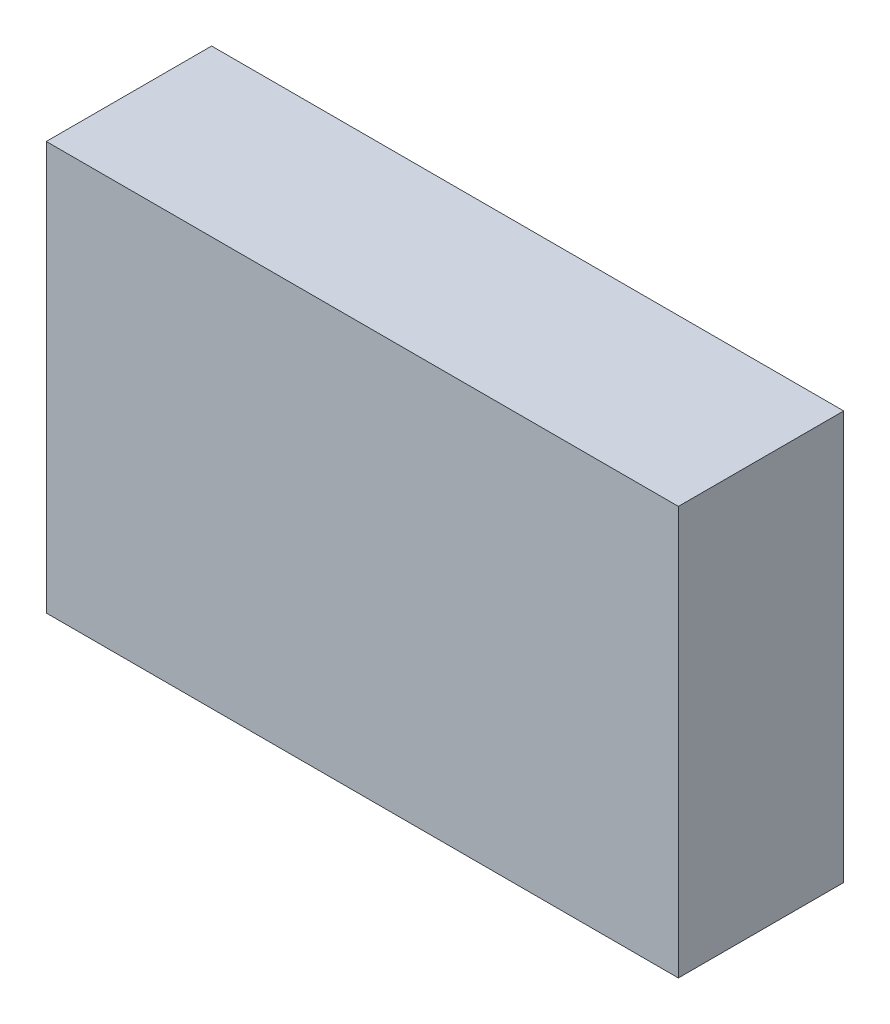
ISO-10303-21;
HEADER;
FILE_DESCRIPTION(('STEP AP214'),'2;1');
FILE_NAME('part.step','',(''),(''),'','','');
FILE_SCHEMA(('AUTOMOTIVE_DESIGN { 1 0 10303 214 1 1 1 1 }'));
ENDSEC;
DATA;
#1=APPLICATION_CONTEXT('core data for automotive mechanical design processes');
#2=APPLICATION_PROTOCOL_DEFINITION('international standard','automotive_design',2000,#1);
#3=PRODUCT_CONTEXT('',#1,'mechanical');
#4=PRODUCT('Part','Part','',(#3));
#5=PRODUCT_RELATED_PRODUCT_CATEGORY('part','',(#4));
#6=PRODUCT_DEFINITION_FORMATION('','',#4);
#7=PRODUCT_DEFINITION_CONTEXT('part definition',#1,'design');
#8=PRODUCT_DEFINITION('design','',#6,#7);
#9=PRODUCT_DEFINITION_SHAPE('','',#8);
#10=(LENGTH_UNIT() NAMED_UNIT(*) SI_UNIT(.MILLI.,.METRE.));
#11=(NAMED_UNIT(*) PLANE_ANGLE_UNIT() SI_UNIT($,.RADIAN.));
#12=(NAMED_UNIT(*) SI_UNIT($,.STERADIAN.) SOLID_ANGLE_UNIT());
#13=UNCERTAINTY_MEASURE_WITH_UNIT(LENGTH_MEASURE(1.E-05),#10,'distance_accuracy_value','');
#14=(GEOMETRIC_REPRESENTATION_CONTEXT(3) GLOBAL_UNCERTAINTY_ASSIGNED_CONTEXT((#13)) GLOBAL_UNIT_ASSIGNED_CONTEXT((#10,
#11,#12)) REPRESENTATION_CONTEXT('',''));
#15=CARTESIAN_POINT('',(0.,0.,0.));
#16=DIRECTION('',(0.,0.,1.));
#17=DIRECTION('',(1.,0.,0.));
#18=AXIS2_PLACEMENT_3D('',#15,#16,#17);
#19=CARTESIAN_POINT('',(0.,0.,8.5));
#20=DIRECTION('',(0.,0.,1.));
#21=DIRECTION('',(1.,0.,0.));
#22=AXIS2_PLACEMENT_3D('',#19,#20,#21);
#23=PLANE('',#22);
#24=DIRECTION('',(-1.,0.,0.));
#25=VECTOR('',#24,1.);
#26=CARTESIAN_POINT('',(0.,-21.,8.5));
#27=LINE('',#26,#25);
#28=CARTESIAN_POINT('',(32.5,-21.,8.5));
#29=VERTEX_POINT('',#28);
#30=CARTESIAN_POINT('',(-32.5,-21.,8.5));
#31=VERTEX_POINT('',#30);
#32=EDGE_CURVE('E10',#29,#31,#27,.T.);
#33=ORIENTED_EDGE('',*,*,#32,.F.);
#34=DIRECTION('',(0.,-1.,0.));
#35=VECTOR('',#34,1.);
#36=CARTESIAN_POINT('',(32.5,0.,8.5));
#37=LINE('',#36,#35);
#38=CARTESIAN_POINT('',(32.5,21.,8.5));
#39=VERTEX_POINT('',#38);
#40=EDGE_CURVE('E58',#39,#29,#37,.T.);
#41=ORIENTED_EDGE('',*,*,#40,.F.);
#42=DIRECTION('',(1.,0.,0.));
#43=VECTOR('',#42,1.);
#44=CARTESIAN_POINT('',(0.,21.,8.5));
#45=LINE('',#44,#43);
#46=CARTESIAN_POINT('',(-32.5,21.,8.5));
#47=VERTEX_POINT('',#46);
#48=EDGE_CURVE('E88',#47,#39,#45,.T.);
#49=ORIENTED_EDGE('',*,*,#48,.F.);
#50=DIRECTION('',(0.,1.,0.));
#51=VECTOR('',#50,1.);
#52=CARTESIAN_POINT('',(-32.5,0.,8.5));
#53=LINE('',#52,#51);
#54=EDGE_CURVE('E23',#31,#47,#53,.T.);
#55=ORIENTED_EDGE('',*,*,#54,.F.);
#56=EDGE_LOOP('',(#33,#41,#49,#55));
#57=FACE_BOUND('',#56,.T.);
#58=ADVANCED_FACE('F16',(#57),#23,.T.);
#59=CARTESIAN_POINT('',(0.,-21.,-8.5));
#60=DIRECTION('',(0.,-1.,0.));
#61=DIRECTION('',(0.,0.,-1.));
#62=AXIS2_PLACEMENT_3D('',#59,#60,#61);
#63=PLANE('',#62);
#64=DIRECTION('',(0.,0.,1.));
#65=VECTOR('',#64,1.);
#66=CARTESIAN_POINT('',(32.5,-21.,-8.5));
#67=LINE('',#66,#65);
#68=CARTESIAN_POINT('',(32.5,-21.,-8.5));
#69=VERTEX_POINT('',#68);
#70=EDGE_CURVE('E52',#69,#29,#67,.T.);
#71=ORIENTED_EDGE('',*,*,#70,.T.);
#72=ORIENTED_EDGE('',*,*,#32,.T.);
#73=DIRECTION('',(0.,0.,1.));
#74=VECTOR('',#73,1.);
#75=CARTESIAN_POINT('',(-32.5,-21.,-8.5));
#76=LINE('',#75,#74);
#77=CARTESIAN_POINT('',(-32.5,-21.,-8.5));
#78=VERTEX_POINT('',#77);
#79=EDGE_CURVE('E66',#78,#31,#76,.T.);
#80=ORIENTED_EDGE('',*,*,#79,.F.);
#81=DIRECTION('',(1.,0.,0.));
#82=VECTOR('',#81,1.);
#83=CARTESIAN_POINT('',(0.,-21.,-8.5));
#84=LINE('',#83,#82);
#85=EDGE_CURVE('E63',#78,#69,#84,.T.);
#86=ORIENTED_EDGE('',*,*,#85,.T.);
#87=EDGE_LOOP('',(#71,#72,#80,#86));
#88=FACE_BOUND('',#87,.T.);
#89=ADVANCED_FACE('F65',(#88),#63,.T.);
#90=CARTESIAN_POINT('',(-32.5,0.,-8.5));
#91=DIRECTION('',(-1.,0.,0.));
#92=DIRECTION('',(0.,0.,1.));
#93=AXIS2_PLACEMENT_3D('',#90,#91,#92);
#94=PLANE('',#93);
#95=ORIENTED_EDGE('',*,*,#79,.T.);
#96=ORIENTED_EDGE('',*,*,#54,.T.);
#97=DIRECTION('',(0.,0.,1.));
#98=VECTOR('',#97,1.);
#99=CARTESIAN_POINT('',(-32.5,21.,-8.5));
#100=LINE('',#99,#98);
#101=CARTESIAN_POINT('',(-32.5,21.,-8.5));
#102=VERTEX_POINT('',#101);
#103=EDGE_CURVE('E81',#102,#47,#100,.T.);
#104=ORIENTED_EDGE('',*,*,#103,.F.);
#105=DIRECTION('',(0.,-1.,0.));
#106=VECTOR('',#105,1.);
#107=CARTESIAN_POINT('',(-32.5,0.,-8.5));
#108=LINE('',#107,#106);
#109=EDGE_CURVE('E69',#102,#78,#108,.T.);
#110=ORIENTED_EDGE('',*,*,#109,.T.);
#111=EDGE_LOOP('',(#95,#96,#104,#110));
#112=FACE_BOUND('',#111,.T.);
#113=ADVANCED_FACE('F89',(#112),#94,.T.);
#114=CARTESIAN_POINT('',(0.,21.,-8.5));
#115=DIRECTION('',(0.,1.,0.));
#116=DIRECTION('',(0.,0.,1.));
#117=AXIS2_PLACEMENT_3D('',#114,#115,#116);
#118=PLANE('',#117);
#119=ORIENTED_EDGE('',*,*,#103,.T.);
#120=ORIENTED_EDGE('',*,*,#48,.T.);
#121=DIRECTION('',(0.,0.,1.));
#122=VECTOR('',#121,1.);
#123=CARTESIAN_POINT('',(32.5,21.,-8.5));
#124=LINE('',#123,#122);
#125=CARTESIAN_POINT('',(32.5,21.,-8.5));
#126=VERTEX_POINT('',#125);
#127=EDGE_CURVE('E61',#126,#39,#124,.T.);
#128=ORIENTED_EDGE('',*,*,#127,.F.);
#129=DIRECTION('',(-1.,0.,0.));
#130=VECTOR('',#129,1.);
#131=CARTESIAN_POINT('',(0.,21.,-8.5));
#132=LINE('',#131,#130);
#133=EDGE_CURVE('E74',#126,#102,#132,.T.);
#134=ORIENTED_EDGE('',*,*,#133,.T.);
#135=EDGE_LOOP('',(#119,#120,#128,#134));
#136=FACE_BOUND('',#135,.T.);
#137=ADVANCED_FACE('F86',(#136),#118,.T.);
#138=CARTESIAN_POINT('',(0.,0.,-8.5));
#139=DIRECTION('',(0.,0.,-1.));
#140=DIRECTION('',(-1.,0.,0.));
#141=AXIS2_PLACEMENT_3D('',#138,#139,#140);
#142=PLANE('',#141);
#143=DIRECTION('',(0.,1.,0.));
#144=VECTOR('',#143,1.);
#145=CARTESIAN_POINT('',(32.5,0.,-8.5));
#146=LINE('',#145,#144);
#147=EDGE_CURVE('E59',#69,#126,#146,.T.);
#148=ORIENTED_EDGE('',*,*,#147,.F.);
#149=ORIENTED_EDGE('',*,*,#85,.F.);
#150=ORIENTED_EDGE('',*,*,#109,.F.);
#151=ORIENTED_EDGE('',*,*,#133,.F.);
#152=EDGE_LOOP('',(#148,#149,#150,#151));
#153=FACE_BOUND('',#152,.T.);
#154=ADVANCED_FACE('F73',(#153),#142,.T.);
#155=CARTESIAN_POINT('',(32.5,0.,-8.5));
#156=DIRECTION('',(1.,0.,0.));
#157=DIRECTION('',(0.,0.,-1.));
#158=AXIS2_PLACEMENT_3D('',#155,#156,#157);
#159=PLANE('',#158);
#160=ORIENTED_EDGE('',*,*,#147,.T.);
#161=ORIENTED_EDGE('',*,*,#127,.T.);
#162=ORIENTED_EDGE('',*,*,#40,.T.);
#163=ORIENTED_EDGE('',*,*,#70,.F.);
#164=EDGE_LOOP('',(#160,#161,#162,#163));
#165=FACE_BOUND('',#164,.T.);
#166=ADVANCED_FACE('F54',(#165),#159,.T.);
#167=CLOSED_SHELL('',(#58,#89,#113,#137,#154,#166));
#168=MANIFOLD_SOLID_BREP('B1',#167);
#169=ADVANCED_BREP_SHAPE_REPRESENTATION('',(#18,#168),#14);
#170=SHAPE_DEFINITION_REPRESENTATION(#9,#169);
ENDSEC;
END-ISO-10303-21;
